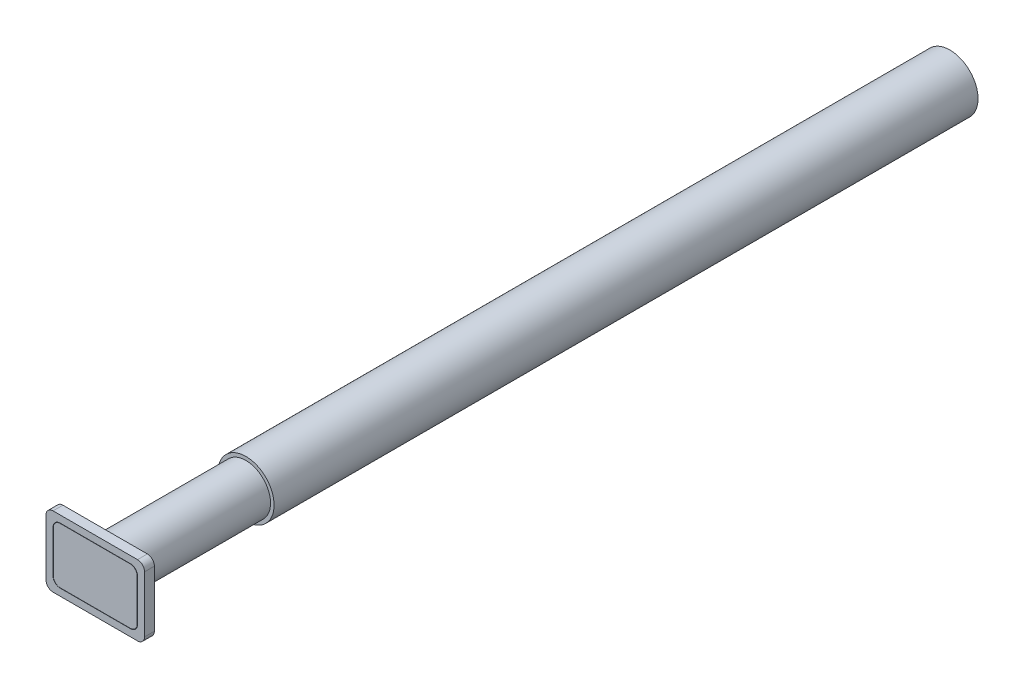
ISO-10303-21;
HEADER;
FILE_DESCRIPTION(('STEP AP214'),'2;1');
FILE_NAME('part.step','',(''),(''),'','','');
FILE_SCHEMA(('AUTOMOTIVE_DESIGN { 1 0 10303 214 1 1 1 1 }'));
ENDSEC;
DATA;
#1=APPLICATION_CONTEXT('core data for automotive mechanical design processes');
#2=APPLICATION_PROTOCOL_DEFINITION('international standard','automotive_design',2000,#1);
#3=PRODUCT_CONTEXT('',#1,'mechanical');
#4=PRODUCT('Part','Part','',(#3));
#5=PRODUCT_RELATED_PRODUCT_CATEGORY('part','',(#4));
#6=PRODUCT_DEFINITION_FORMATION('','',#4);
#7=PRODUCT_DEFINITION_CONTEXT('part definition',#1,'design');
#8=PRODUCT_DEFINITION('design','',#6,#7);
#9=PRODUCT_DEFINITION_SHAPE('','',#8);
#10=(LENGTH_UNIT() NAMED_UNIT(*) SI_UNIT(.MILLI.,.METRE.));
#11=(NAMED_UNIT(*) PLANE_ANGLE_UNIT() SI_UNIT($,.RADIAN.));
#12=(NAMED_UNIT(*) SI_UNIT($,.STERADIAN.) SOLID_ANGLE_UNIT());
#13=UNCERTAINTY_MEASURE_WITH_UNIT(LENGTH_MEASURE(1.E-05),#10,'distance_accuracy_value','');
#14=(GEOMETRIC_REPRESENTATION_CONTEXT(3) GLOBAL_UNCERTAINTY_ASSIGNED_CONTEXT((#13)) GLOBAL_UNIT_ASSIGNED_CONTEXT((#10,
#11,#12)) REPRESENTATION_CONTEXT('',''));
#15=CARTESIAN_POINT('',(0.,0.,0.));
#16=DIRECTION('',(0.,0.,1.));
#17=DIRECTION('',(1.,0.,0.));
#18=AXIS2_PLACEMENT_3D('',#15,#16,#17);
#19=CARTESIAN_POINT('',(31.496,18.796,770.89));
#20=DIRECTION('',(0.,0.,-1.));
#21=DIRECTION('',(-1.,0.,0.));
#22=AXIS2_PLACEMENT_3D('',#19,#20,#21);
#23=CYLINDRICAL_SURFACE('',#22,6.35);
#24=CARTESIAN_POINT('',(31.496,18.796,764.794));
#25=DIRECTION('',(0.,0.,1.));
#26=DIRECTION('',(-1.,0.,0.));
#27=AXIS2_PLACEMENT_3D('',#24,#25,#26);
#28=CIRCLE('',#27,6.35);
#29=CARTESIAN_POINT('',(37.846,18.796,764.794));
#30=VERTEX_POINT('',#29);
#31=CARTESIAN_POINT('',(31.496,25.146,764.794));
#32=VERTEX_POINT('',#31);
#33=EDGE_CURVE('E153',#30,#32,#28,.T.);
#34=ORIENTED_EDGE('',*,*,#33,.T.);
#35=DIRECTION('',(0.,0.,-1.));
#36=VECTOR('',#35,1.);
#37=CARTESIAN_POINT('',(31.496,25.146,770.89));
#38=LINE('',#37,#36);
#39=CARTESIAN_POINT('',(31.496,25.146,770.89));
#40=VERTEX_POINT('',#39);
#41=EDGE_CURVE('E12',#40,#32,#38,.T.);
#42=ORIENTED_EDGE('',*,*,#41,.F.);
#43=CARTESIAN_POINT('',(31.496,18.796,770.89));
#44=DIRECTION('',(0.,0.,1.));
#45=DIRECTION('',(-1.,0.,0.));
#46=AXIS2_PLACEMENT_3D('',#43,#44,#45);
#47=CIRCLE('',#46,6.35);
#48=CARTESIAN_POINT('',(37.846,18.796,770.89));
#49=VERTEX_POINT('',#48);
#50=EDGE_CURVE('E167',#49,#40,#47,.T.);
#51=ORIENTED_EDGE('',*,*,#50,.F.);
#52=DIRECTION('',(0.,0.,-1.));
#53=VECTOR('',#52,1.);
#54=CARTESIAN_POINT('',(37.846,18.796,770.89));
#55=LINE('',#54,#53);
#56=EDGE_CURVE('E149',#49,#30,#55,.T.);
#57=ORIENTED_EDGE('',*,*,#56,.T.);
#58=EDGE_LOOP('',(#34,#42,#51,#57));
#59=FACE_BOUND('',#58,.T.);
#60=ADVANCED_FACE('F57',(#59),#23,.T.);
#61=CARTESIAN_POINT('',(-31.496,25.146,770.89));
#62=DIRECTION('',(0.,-1.,0.));
#63=DIRECTION('',(1.,0.,0.));
#64=AXIS2_PLACEMENT_3D('',#61,#62,#63);
#65=PLANE('',#64);
#66=DIRECTION('',(-1.,0.,0.));
#67=VECTOR('',#66,1.);
#68=CARTESIAN_POINT('',(-31.496,25.146,764.794));
#69=LINE('',#68,#67);
#70=CARTESIAN_POINT('',(-31.496,25.146,764.794));
#71=VERTEX_POINT('',#70);
#72=EDGE_CURVE('E156',#32,#71,#69,.T.);
#73=ORIENTED_EDGE('',*,*,#72,.T.);
#74=DIRECTION('',(0.,0.,-1.));
#75=VECTOR('',#74,1.);
#76=CARTESIAN_POINT('',(-31.496,25.146,770.89));
#77=LINE('',#76,#75);
#78=CARTESIAN_POINT('',(-31.496,25.146,770.89));
#79=VERTEX_POINT('',#78);
#80=EDGE_CURVE('E65',#79,#71,#77,.T.);
#81=ORIENTED_EDGE('',*,*,#80,.F.);
#82=DIRECTION('',(-1.,0.,0.));
#83=VECTOR('',#82,1.);
#84=CARTESIAN_POINT('',(-31.496,25.146,770.89));
#85=LINE('',#84,#83);
#86=EDGE_CURVE('E116',#40,#79,#85,.T.);
#87=ORIENTED_EDGE('',*,*,#86,.F.);
#88=ORIENTED_EDGE('',*,*,#41,.T.);
#89=EDGE_LOOP('',(#73,#81,#87,#88));
#90=FACE_BOUND('',#89,.T.);
#91=ADVANCED_FACE('F202',(#90),#65,.F.);
#92=CARTESIAN_POINT('',(-31.496,18.796,770.89));
#93=DIRECTION('',(0.,0.,-1.));
#94=DIRECTION('',(-1.,0.,0.));
#95=AXIS2_PLACEMENT_3D('',#92,#93,#94);
#96=CYLINDRICAL_SURFACE('',#95,6.35);
#97=CARTESIAN_POINT('',(-31.496,18.796,764.794));
#98=DIRECTION('',(0.,0.,1.));
#99=DIRECTION('',(1.,0.,0.));
#100=AXIS2_PLACEMENT_3D('',#97,#98,#99);
#101=CIRCLE('',#100,6.35);
#102=CARTESIAN_POINT('',(-37.846,18.796,764.794));
#103=VERTEX_POINT('',#102);
#104=EDGE_CURVE('E158',#71,#103,#101,.T.);
#105=ORIENTED_EDGE('',*,*,#104,.T.);
#106=DIRECTION('',(0.,0.,-1.));
#107=VECTOR('',#106,1.);
#108=CARTESIAN_POINT('',(-37.846,18.796,770.89));
#109=LINE('',#108,#107);
#110=CARTESIAN_POINT('',(-37.846,18.796,770.89));
#111=VERTEX_POINT('',#110);
#112=EDGE_CURVE('E174',#111,#103,#109,.T.);
#113=ORIENTED_EDGE('',*,*,#112,.F.);
#114=CARTESIAN_POINT('',(-31.496,18.796,770.89));
#115=DIRECTION('',(0.,0.,1.));
#116=DIRECTION('',(1.,0.,0.));
#117=AXIS2_PLACEMENT_3D('',#114,#115,#116);
#118=CIRCLE('',#117,6.35);
#119=EDGE_CURVE('E182',#79,#111,#118,.T.);
#120=ORIENTED_EDGE('',*,*,#119,.F.);
#121=ORIENTED_EDGE('',*,*,#80,.T.);
#122=EDGE_LOOP('',(#105,#113,#120,#121));
#123=FACE_BOUND('',#122,.T.);
#124=ADVANCED_FACE('F180',(#123),#96,.T.);
#125=CARTESIAN_POINT('',(-37.846,18.796,770.89));
#126=DIRECTION('',(1.,0.,0.));
#127=DIRECTION('',(0.,0.,-1.));
#128=AXIS2_PLACEMENT_3D('',#125,#126,#127);
#129=PLANE('',#128);
#130=DIRECTION('',(0.,-1.,0.));
#131=VECTOR('',#130,1.);
#132=CARTESIAN_POINT('',(-37.846,18.796,764.794));
#133=LINE('',#132,#131);
#134=CARTESIAN_POINT('',(-37.846,-18.796,764.794));
#135=VERTEX_POINT('',#134);
#136=EDGE_CURVE('E160',#103,#135,#133,.T.);
#137=ORIENTED_EDGE('',*,*,#136,.T.);
#138=DIRECTION('',(0.,0.,-1.));
#139=VECTOR('',#138,1.);
#140=CARTESIAN_POINT('',(-37.846,-18.796,770.89));
#141=LINE('',#140,#139);
#142=CARTESIAN_POINT('',(-37.846,-18.796,770.89));
#143=VERTEX_POINT('',#142);
#144=EDGE_CURVE('E171',#143,#135,#141,.T.);
#145=ORIENTED_EDGE('',*,*,#144,.F.);
#146=DIRECTION('',(0.,-1.,0.));
#147=VECTOR('',#146,1.);
#148=CARTESIAN_POINT('',(-37.846,18.796,770.89));
#149=LINE('',#148,#147);
#150=EDGE_CURVE('E194',#111,#143,#149,.T.);
#151=ORIENTED_EDGE('',*,*,#150,.F.);
#152=ORIENTED_EDGE('',*,*,#112,.T.);
#153=EDGE_LOOP('',(#137,#145,#151,#152));
#154=FACE_BOUND('',#153,.T.);
#155=ADVANCED_FACE('F190',(#154),#129,.F.);
#156=CARTESIAN_POINT('',(-31.496,-18.796,770.89));
#157=DIRECTION('',(0.,0.,-1.));
#158=DIRECTION('',(-1.,0.,0.));
#159=AXIS2_PLACEMENT_3D('',#156,#157,#158);
#160=CYLINDRICAL_SURFACE('',#159,6.35);
#161=CARTESIAN_POINT('',(-31.496,-18.796,764.794));
#162=DIRECTION('',(0.,0.,1.));
#163=DIRECTION('',(1.,0.,0.));
#164=AXIS2_PLACEMENT_3D('',#161,#162,#163);
#165=CIRCLE('',#164,6.35);
#166=CARTESIAN_POINT('',(-31.496,-25.146,764.794));
#167=VERTEX_POINT('',#166);
#168=EDGE_CURVE('E162',#135,#167,#165,.T.);
#169=ORIENTED_EDGE('',*,*,#168,.T.);
#170=DIRECTION('',(0.,0.,-1.));
#171=VECTOR('',#170,1.);
#172=CARTESIAN_POINT('',(-31.496,-25.146,770.89));
#173=LINE('',#172,#171);
#174=CARTESIAN_POINT('',(-31.496,-25.146,770.89));
#175=VERTEX_POINT('',#174);
#176=EDGE_CURVE('E144',#175,#167,#173,.T.);
#177=ORIENTED_EDGE('',*,*,#176,.F.);
#178=CARTESIAN_POINT('',(-31.496,-18.796,770.89));
#179=DIRECTION('',(0.,0.,1.));
#180=DIRECTION('',(1.,0.,0.));
#181=AXIS2_PLACEMENT_3D('',#178,#179,#180);
#182=CIRCLE('',#181,6.35);
#183=EDGE_CURVE('E135',#143,#175,#182,.T.);
#184=ORIENTED_EDGE('',*,*,#183,.F.);
#185=ORIENTED_EDGE('',*,*,#144,.T.);
#186=EDGE_LOOP('',(#169,#177,#184,#185));
#187=FACE_BOUND('',#186,.T.);
#188=ADVANCED_FACE('F193',(#187),#160,.T.);
#189=CARTESIAN_POINT('',(-31.496,-25.146,770.89));
#190=DIRECTION('',(0.,1.,0.));
#191=DIRECTION('',(0.,0.,1.));
#192=AXIS2_PLACEMENT_3D('',#189,#190,#191);
#193=PLANE('',#192);
#194=DIRECTION('',(1.,0.,0.));
#195=VECTOR('',#194,1.);
#196=CARTESIAN_POINT('',(-31.496,-25.146,764.794));
#197=LINE('',#196,#195);
#198=CARTESIAN_POINT('',(31.496,-25.146,764.794));
#199=VERTEX_POINT('',#198);
#200=EDGE_CURVE('E143',#167,#199,#197,.T.);
#201=ORIENTED_EDGE('',*,*,#200,.T.);
#202=DIRECTION('',(0.,0.,-1.));
#203=VECTOR('',#202,1.);
#204=CARTESIAN_POINT('',(31.496,-25.146,770.89));
#205=LINE('',#204,#203);
#206=CARTESIAN_POINT('',(31.496,-25.146,770.89));
#207=VERTEX_POINT('',#206);
#208=EDGE_CURVE('E140',#207,#199,#205,.T.);
#209=ORIENTED_EDGE('',*,*,#208,.F.);
#210=DIRECTION('',(1.,0.,0.));
#211=VECTOR('',#210,1.);
#212=CARTESIAN_POINT('',(-31.496,-25.146,770.89));
#213=LINE('',#212,#211);
#214=EDGE_CURVE('E129',#175,#207,#213,.T.);
#215=ORIENTED_EDGE('',*,*,#214,.F.);
#216=ORIENTED_EDGE('',*,*,#176,.T.);
#217=EDGE_LOOP('',(#201,#209,#215,#216));
#218=FACE_BOUND('',#217,.T.);
#219=ADVANCED_FACE('F141',(#218),#193,.F.);
#220=CARTESIAN_POINT('',(31.496,-18.796,770.89));
#221=DIRECTION('',(0.,0.,-1.));
#222=DIRECTION('',(-1.,0.,0.));
#223=AXIS2_PLACEMENT_3D('',#220,#221,#222);
#224=CYLINDRICAL_SURFACE('',#223,6.35);
#225=CARTESIAN_POINT('',(31.496,-18.796,764.794));
#226=DIRECTION('',(0.,0.,1.));
#227=DIRECTION('',(1.,0.,0.));
#228=AXIS2_PLACEMENT_3D('',#225,#226,#227);
#229=CIRCLE('',#228,6.35);
#230=CARTESIAN_POINT('',(37.846,-18.796,764.794));
#231=VERTEX_POINT('',#230);
#232=EDGE_CURVE('E102',#199,#231,#229,.T.);
#233=ORIENTED_EDGE('',*,*,#232,.T.);
#234=DIRECTION('',(0.,0.,-1.));
#235=VECTOR('',#234,1.);
#236=CARTESIAN_POINT('',(37.846,-18.796,770.89));
#237=LINE('',#236,#235);
#238=CARTESIAN_POINT('',(37.846,-18.796,770.89));
#239=VERTEX_POINT('',#238);
#240=EDGE_CURVE('E145',#239,#231,#237,.T.);
#241=ORIENTED_EDGE('',*,*,#240,.F.);
#242=CARTESIAN_POINT('',(31.496,-18.796,770.89));
#243=DIRECTION('',(0.,0.,1.));
#244=DIRECTION('',(1.,0.,0.));
#245=AXIS2_PLACEMENT_3D('',#242,#243,#244);
#246=CIRCLE('',#245,6.35);
#247=EDGE_CURVE('E133',#207,#239,#246,.T.);
#248=ORIENTED_EDGE('',*,*,#247,.F.);
#249=ORIENTED_EDGE('',*,*,#208,.T.);
#250=EDGE_LOOP('',(#233,#241,#248,#249));
#251=FACE_BOUND('',#250,.T.);
#252=ADVANCED_FACE('F147',(#251),#224,.T.);
#253=CARTESIAN_POINT('',(37.846,18.796,770.89));
#254=DIRECTION('',(-1.,0.,0.));
#255=DIRECTION('',(0.,-1.,0.));
#256=AXIS2_PLACEMENT_3D('',#253,#254,#255);
#257=PLANE('',#256);
#258=DIRECTION('',(0.,1.,0.));
#259=VECTOR('',#258,1.);
#260=CARTESIAN_POINT('',(37.846,18.796,764.794));
#261=LINE('',#260,#259);
#262=EDGE_CURVE('E108',#231,#30,#261,.T.);
#263=ORIENTED_EDGE('',*,*,#262,.T.);
#264=ORIENTED_EDGE('',*,*,#56,.F.);
#265=DIRECTION('',(0.,1.,0.));
#266=VECTOR('',#265,1.);
#267=CARTESIAN_POINT('',(37.846,18.796,770.89));
#268=LINE('',#267,#266);
#269=EDGE_CURVE('E73',#239,#49,#268,.T.);
#270=ORIENTED_EDGE('',*,*,#269,.F.);
#271=ORIENTED_EDGE('',*,*,#240,.T.);
#272=EDGE_LOOP('',(#263,#264,#270,#271));
#273=FACE_BOUND('',#272,.T.);
#274=ADVANCED_FACE('F218',(#273),#257,.F.);
#275=CARTESIAN_POINT('',(31.496,18.796,770.89));
#276=DIRECTION('',(0.,0.,-1.));
#277=DIRECTION('',(-1.,0.,0.));
#278=AXIS2_PLACEMENT_3D('',#275,#276,#277);
#279=PLANE('',#278);
#280=ORIENTED_EDGE('',*,*,#50,.T.);
#281=ORIENTED_EDGE('',*,*,#86,.T.);
#282=ORIENTED_EDGE('',*,*,#119,.T.);
#283=ORIENTED_EDGE('',*,*,#150,.T.);
#284=ORIENTED_EDGE('',*,*,#183,.T.);
#285=ORIENTED_EDGE('',*,*,#214,.T.);
#286=ORIENTED_EDGE('',*,*,#247,.T.);
#287=ORIENTED_EDGE('',*,*,#269,.T.);
#288=EDGE_LOOP('',(#280,#281,#282,#283,#284,#285,#286,#287));
#289=FACE_BOUND('',#288,.T.);
#290=ADVANCED_FACE('F131',(#289),#279,.F.);
#291=CARTESIAN_POINT('',(31.496,18.796,764.794));
#292=DIRECTION('',(0.,0.,-1.));
#293=DIRECTION('',(-1.,0.,0.));
#294=AXIS2_PLACEMENT_3D('',#291,#292,#293);
#295=PLANE('',#294);
#296=ORIENTED_EDGE('',*,*,#33,.F.);
#297=ORIENTED_EDGE('',*,*,#262,.F.);
#298=ORIENTED_EDGE('',*,*,#232,.F.);
#299=ORIENTED_EDGE('',*,*,#200,.F.);
#300=ORIENTED_EDGE('',*,*,#168,.F.);
#301=ORIENTED_EDGE('',*,*,#136,.F.);
#302=ORIENTED_EDGE('',*,*,#104,.F.);
#303=ORIENTED_EDGE('',*,*,#72,.F.);
#304=EDGE_LOOP('',(#296,#297,#298,#299,#300,#301,#302,#303));
#305=FACE_BOUND('',#304,.T.);
#306=ADVANCED_FACE('F186',(#305),#295,.T.);
#307=CLOSED_SHELL('',(#60,#91,#124,#155,#188,#219,#252,#274,#290,#306));
#308=MANIFOLD_SOLID_BREP('B2',#307);
#309=CARTESIAN_POINT('',(0.,0.,635.));
#310=DIRECTION('',(0.,0.,-1.));
#311=DIRECTION('',(-1.,0.,0.));
#312=AXIS2_PLACEMENT_3D('',#309,#310,#311);
#313=CYLINDRICAL_SURFACE('',#312,25.4);
#314=CARTESIAN_POINT('',(0.,0.,635.));
#315=DIRECTION('',(0.,0.,1.));
#316=DIRECTION('',(1.,0.,0.));
#317=AXIS2_PLACEMENT_3D('',#314,#315,#316);
#318=CIRCLE('',#317,25.4);
#319=CARTESIAN_POINT('',(-25.4,0.,635.));
#320=VERTEX_POINT('',#319);
#321=EDGE_CURVE('E293',#320,#320,#318,.T.);
#322=CARTESIAN_POINT('',(0.,0.,0.));
#323=DIRECTION('',(0.,0.,1.));
#324=DIRECTION('',(1.,0.,0.));
#325=AXIS2_PLACEMENT_3D('',#322,#323,#324);
#326=CIRCLE('',#325,25.4);
#327=CARTESIAN_POINT('',(-25.4,0.,-1.11022302462516E-13));
#328=VERTEX_POINT('',#327);
#329=EDGE_CURVE('E288',#328,#328,#326,.T.);
#330=CARTESIAN_POINT('',(-25.4,0.,635.));
#331=CARTESIAN_POINT('',(-25.4,0.,628.385416666667));
#332=CARTESIAN_POINT('',(-25.4,0.,621.770833333333));
#333=CARTESIAN_POINT('',(-25.4,0.,608.541666666667));
#334=CARTESIAN_POINT('',(-25.4,0.,601.927083333333));
#335=CARTESIAN_POINT('',(-25.4,0.,588.697916666667));
#336=CARTESIAN_POINT('',(-25.4,0.,582.083333333333));
#337=CARTESIAN_POINT('',(-25.4,0.,568.854166666667));
#338=CARTESIAN_POINT('',(-25.4,0.,562.239583333333));
#339=CARTESIAN_POINT('',(-25.4,0.,549.010416666667));
#340=CARTESIAN_POINT('',(-25.4,0.,542.395833333333));
#341=CARTESIAN_POINT('',(-25.4,0.,529.166666666667));
#342=CARTESIAN_POINT('',(-25.4,0.,522.552083333333));
#343=CARTESIAN_POINT('',(-25.4,0.,509.322916666667));
#344=CARTESIAN_POINT('',(-25.4,0.,502.708333333333));
#345=CARTESIAN_POINT('',(-25.4,0.,489.479166666667));
#346=CARTESIAN_POINT('',(-25.4,0.,482.864583333333));
#347=CARTESIAN_POINT('',(-25.4,0.,469.635416666667));
#348=CARTESIAN_POINT('',(-25.4,0.,463.020833333333));
#349=CARTESIAN_POINT('',(-25.4,0.,449.791666666667));
#350=CARTESIAN_POINT('',(-25.4,0.,443.177083333333));
#351=CARTESIAN_POINT('',(-25.4,0.,429.947916666667));
#352=CARTESIAN_POINT('',(-25.4,0.,423.333333333333));
#353=CARTESIAN_POINT('',(-25.4,0.,410.104166666667));
#354=CARTESIAN_POINT('',(-25.4,0.,403.489583333333));
#355=CARTESIAN_POINT('',(-25.4,0.,390.260416666667));
#356=CARTESIAN_POINT('',(-25.4,0.,383.645833333333));
#357=CARTESIAN_POINT('',(-25.4,0.,370.416666666667));
#358=CARTESIAN_POINT('',(-25.4,0.,363.802083333333));
#359=CARTESIAN_POINT('',(-25.4,0.,350.572916666667));
#360=CARTESIAN_POINT('',(-25.4,0.,343.958333333333));
#361=CARTESIAN_POINT('',(-25.4,0.,330.729166666667));
#362=CARTESIAN_POINT('',(-25.4,0.,324.114583333333));
#363=CARTESIAN_POINT('',(-25.4,0.,310.885416666667));
#364=CARTESIAN_POINT('',(-25.4,0.,304.270833333333));
#365=CARTESIAN_POINT('',(-25.4,0.,291.041666666667));
#366=CARTESIAN_POINT('',(-25.4,0.,284.427083333333));
#367=CARTESIAN_POINT('',(-25.4,0.,271.197916666667));
#368=CARTESIAN_POINT('',(-25.4,0.,264.583333333333));
#369=CARTESIAN_POINT('',(-25.4,0.,251.354166666667));
#370=CARTESIAN_POINT('',(-25.4,0.,244.739583333333));
#371=CARTESIAN_POINT('',(-25.4,0.,231.510416666667));
#372=CARTESIAN_POINT('',(-25.4,0.,224.895833333333));
#373=CARTESIAN_POINT('',(-25.4,0.,211.666666666667));
#374=CARTESIAN_POINT('',(-25.4,0.,205.052083333333));
#375=CARTESIAN_POINT('',(-25.4,0.,191.822916666667));
#376=CARTESIAN_POINT('',(-25.4,0.,185.208333333333));
#377=CARTESIAN_POINT('',(-25.4,0.,171.979166666667));
#378=CARTESIAN_POINT('',(-25.4,0.,165.364583333333));
#379=CARTESIAN_POINT('',(-25.4,0.,152.135416666667));
#380=CARTESIAN_POINT('',(-25.4,0.,145.520833333333));
#381=CARTESIAN_POINT('',(-25.4,0.,132.291666666667));
#382=CARTESIAN_POINT('',(-25.4,0.,125.677083333333));
#383=CARTESIAN_POINT('',(-25.4,0.,112.447916666667));
#384=CARTESIAN_POINT('',(-25.4,0.,105.833333333333));
#385=CARTESIAN_POINT('',(-25.4,0.,92.6041666666666));
#386=CARTESIAN_POINT('',(-25.4,0.,85.9895833333332));
#387=CARTESIAN_POINT('',(-25.4,0.,72.7604166666665));
#388=CARTESIAN_POINT('',(-25.4,0.,66.1458333333332));
#389=CARTESIAN_POINT('',(-25.4,0.,52.9166666666666));
#390=CARTESIAN_POINT('',(-25.4,0.,46.3020833333332));
#391=CARTESIAN_POINT('',(-25.4,0.,33.0729166666666));
#392=CARTESIAN_POINT('',(-25.4,0.,26.4583333333333));
#393=CARTESIAN_POINT('',(-25.4,0.,13.2291666666666));
#394=CARTESIAN_POINT('',(-25.4,0.,6.61458333333324));
#395=CARTESIAN_POINT('',(-25.4,0.,-1.11022302462516E-13));
#396=B_SPLINE_CURVE_WITH_KNOTS('',3,(#330,#331,#332,#333,#334,#335,#336,#337,#338,#339,#340,
#341,#342,#343,#344,#345,#346,#347,#348,#349,#350,#351,#352,#353,#354,#355,#356,#357,#358,#359,
#360,#361,#362,#363,#364,#365,#366,#367,#368,#369,#370,#371,#372,#373,#374,#375,#376,#377,#378,
#379,#380,#381,#382,#383,#384,#385,#386,#387,#388,#389,#390,#391,#392,#393,#394,#395),
.UNSPECIFIED.,.F.,.F.,(4,2,2,2,2,2,2,2,2,2,2,2,2,2,2,2,2,2,2,2,2,2,2,2,2,2,2,2,2,2,2,2,4),(0.,
19.8437499999999,39.6875,59.5312499999999,79.375,99.2187499999999,119.0625,138.90625,158.75,
178.59375,198.4375,218.28125,238.125,257.96875,277.8125,297.65625,317.5,337.34375,357.1875,
377.03125,396.875,416.71875,436.5625,456.40625,476.25,496.09375,515.9375,535.78125,555.625,
575.46875,595.3125,615.15625,635.),.UNSPECIFIED.);
#397=EDGE_CURVE('BSEAM285',#320,#328,#396,.T.);
#398=ORIENTED_EDGE('',*,*,#321,.F.);
#399=ORIENTED_EDGE('',*,*,#329,.T.);
#400=ORIENTED_EDGE('',*,*,#397,.T.);
#401=ORIENTED_EDGE('',*,*,#397,.F.);
#402=EDGE_LOOP('',(#398,#400,#399,#401));
#403=FACE_BOUND('',#402,.T.);
#404=ADVANCED_FACE('F285',(#403),#313,.T.);
#405=CARTESIAN_POINT('',(0.,0.,635.));
#406=DIRECTION('',(0.,0.,1.));
#407=DIRECTION('',(1.,0.,0.));
#408=AXIS2_PLACEMENT_3D('',#405,#406,#407);
#409=PLANE('',#408);
#410=CARTESIAN_POINT('',(0.,0.,635.));
#411=DIRECTION('',(0.,0.,1.));
#412=DIRECTION('',(1.,0.,0.));
#413=AXIS2_PLACEMENT_3D('',#410,#411,#412);
#414=CIRCLE('',#413,22.225);
#415=CARTESIAN_POINT('',(22.225,0.,635.));
#416=VERTEX_POINT('',#415);
#417=EDGE_CURVE('E55',#416,#416,#414,.T.);
#418=ORIENTED_EDGE('',*,*,#417,.F.);
#419=EDGE_LOOP('',(#418));
#420=FACE_BOUND('',#419,.T.);
#421=ORIENTED_EDGE('',*,*,#321,.T.);
#422=EDGE_LOOP('',(#421));
#423=FACE_BOUND('',#422,.T.);
#424=ADVANCED_FACE('F439',(#420,#423),#409,.T.);
#425=CARTESIAN_POINT('',(0.,0.,0.));
#426=DIRECTION('',(0.,0.,1.));
#427=DIRECTION('',(1.,0.,0.));
#428=AXIS2_PLACEMENT_3D('',#425,#426,#427);
#429=PLANE('',#428);
#430=ORIENTED_EDGE('',*,*,#329,.F.);
#431=EDGE_LOOP('',(#430));
#432=FACE_BOUND('',#431,.T.);
#433=ADVANCED_FACE('F436',(#432),#429,.F.);
#434=CARTESIAN_POINT('',(0.,0.,762.));
#435=DIRECTION('',(0.,0.,-1.));
#436=DIRECTION('',(-1.,0.,0.));
#437=AXIS2_PLACEMENT_3D('',#434,#435,#436);
#438=CYLINDRICAL_SURFACE('',#437,22.225);
#439=CARTESIAN_POINT('',(0.,0.,762.));
#440=DIRECTION('',(0.,0.,1.));
#441=DIRECTION('',(1.,0.,0.));
#442=AXIS2_PLACEMENT_3D('',#439,#440,#441);
#443=CIRCLE('',#442,22.225);
#444=CARTESIAN_POINT('',(22.225,0.,762.));
#445=VERTEX_POINT('',#444);
#446=EDGE_CURVE('E427',#445,#445,#443,.T.);
#447=ORIENTED_EDGE('',*,*,#446,.F.);
#448=EDGE_LOOP('',(#447));
#449=FACE_BOUND('',#448,.T.);
#450=ORIENTED_EDGE('',*,*,#417,.T.);
#451=EDGE_LOOP('',(#450));
#452=FACE_BOUND('',#451,.T.);
#453=ADVANCED_FACE('F438',(#449,#452),#438,.T.);
#454=CARTESIAN_POINT('',(38.1,25.4,770.89));
#455=DIRECTION('',(0.,0.,-1.));
#456=DIRECTION('',(-1.,0.,0.));
#457=AXIS2_PLACEMENT_3D('',#454,#455,#456);
#458=CYLINDRICAL_SURFACE('',#457,6.35);
#459=CARTESIAN_POINT('',(38.1,25.4,762.));
#460=DIRECTION('',(0.,0.,1.));
#461=DIRECTION('',(-1.,0.,0.));
#462=AXIS2_PLACEMENT_3D('',#459,#460,#461);
#463=CIRCLE('',#462,6.35);
#464=CARTESIAN_POINT('',(44.45,25.4,762.));
#465=VERTEX_POINT('',#464);
#466=CARTESIAN_POINT('',(38.1,31.75,762.));
#467=VERTEX_POINT('',#466);
#468=EDGE_CURVE('E396',#465,#467,#463,.T.);
#469=ORIENTED_EDGE('',*,*,#468,.T.);
#470=DIRECTION('',(0.,0.,-1.));
#471=VECTOR('',#470,1.);
#472=CARTESIAN_POINT('',(38.1,31.75,770.89));
#473=LINE('',#472,#471);
#474=CARTESIAN_POINT('',(38.1,31.75,770.89));
#475=VERTEX_POINT('',#474);
#476=EDGE_CURVE('E425',#475,#467,#473,.T.);
#477=ORIENTED_EDGE('',*,*,#476,.F.);
#478=CARTESIAN_POINT('',(38.1,25.4,770.89));
#479=DIRECTION('',(0.,0.,1.));
#480=DIRECTION('',(-1.,0.,0.));
#481=AXIS2_PLACEMENT_3D('',#478,#479,#480);
#482=CIRCLE('',#481,6.35);
#483=CARTESIAN_POINT('',(44.45,25.4,770.89));
#484=VERTEX_POINT('',#483);
#485=EDGE_CURVE('E412',#484,#475,#482,.T.);
#486=ORIENTED_EDGE('',*,*,#485,.F.);
#487=DIRECTION('',(0.,0.,-1.));
#488=VECTOR('',#487,1.);
#489=CARTESIAN_POINT('',(44.45,25.4,770.89));
#490=LINE('',#489,#488);
#491=EDGE_CURVE('E392',#484,#465,#490,.T.);
#492=ORIENTED_EDGE('',*,*,#491,.T.);
#493=EDGE_LOOP('',(#469,#477,#486,#492));
#494=FACE_BOUND('',#493,.T.);
#495=ADVANCED_FACE('F444',(#494),#458,.T.);
#496=CARTESIAN_POINT('',(-38.1,31.75,770.89));
#497=DIRECTION('',(0.,-1.,0.));
#498=DIRECTION('',(0.,0.,-1.));
#499=AXIS2_PLACEMENT_3D('',#496,#497,#498);
#500=PLANE('',#499);
#501=DIRECTION('',(-1.,0.,0.));
#502=VECTOR('',#501,1.);
#503=CARTESIAN_POINT('',(-38.1,31.75,762.));
#504=LINE('',#503,#502);
#505=CARTESIAN_POINT('',(-38.1,31.75,762.));
#506=VERTEX_POINT('',#505);
#507=EDGE_CURVE('E399',#467,#506,#504,.T.);
#508=ORIENTED_EDGE('',*,*,#507,.T.);
#509=DIRECTION('',(0.,0.,-1.));
#510=VECTOR('',#509,1.);
#511=CARTESIAN_POINT('',(-38.1,31.75,770.89));
#512=LINE('',#511,#510);
#513=CARTESIAN_POINT('',(-38.1,31.75,770.89));
#514=VERTEX_POINT('',#513);
#515=EDGE_CURVE('E422',#514,#506,#512,.T.);
#516=ORIENTED_EDGE('',*,*,#515,.F.);
#517=DIRECTION('',(-1.,0.,0.));
#518=VECTOR('',#517,1.);
#519=CARTESIAN_POINT('',(-38.1,31.75,770.89));
#520=LINE('',#519,#518);
#521=EDGE_CURVE('E352',#475,#514,#520,.T.);
#522=ORIENTED_EDGE('',*,*,#521,.F.);
#523=ORIENTED_EDGE('',*,*,#476,.T.);
#524=EDGE_LOOP('',(#508,#516,#522,#523));
#525=FACE_BOUND('',#524,.T.);
#526=ADVANCED_FACE('F477',(#525),#500,.F.);
#527=CARTESIAN_POINT('',(-38.1,25.4,770.89));
#528=DIRECTION('',(0.,0.,-1.));
#529=DIRECTION('',(-1.,0.,0.));
#530=AXIS2_PLACEMENT_3D('',#527,#528,#529);
#531=CYLINDRICAL_SURFACE('',#530,6.35);
#532=CARTESIAN_POINT('',(-38.1,25.4,762.));
#533=DIRECTION('',(0.,0.,1.));
#534=DIRECTION('',(1.,0.,0.));
#535=AXIS2_PLACEMENT_3D('',#532,#533,#534);
#536=CIRCLE('',#535,6.35);
#537=CARTESIAN_POINT('',(-44.45,25.4,762.));
#538=VERTEX_POINT('',#537);
#539=EDGE_CURVE('E402',#506,#538,#536,.T.);
#540=ORIENTED_EDGE('',*,*,#539,.T.);
#541=DIRECTION('',(0.,0.,-1.));
#542=VECTOR('',#541,1.);
#543=CARTESIAN_POINT('',(-44.45,25.4,770.89));
#544=LINE('',#543,#542);
#545=CARTESIAN_POINT('',(-44.45,25.4,770.89));
#546=VERTEX_POINT('',#545);
#547=EDGE_CURVE('E419',#546,#538,#544,.T.);
#548=ORIENTED_EDGE('',*,*,#547,.F.);
#549=CARTESIAN_POINT('',(-38.1,25.4,770.89));
#550=DIRECTION('',(0.,0.,1.));
#551=DIRECTION('',(1.,0.,0.));
#552=AXIS2_PLACEMENT_3D('',#549,#550,#551);
#553=CIRCLE('',#552,6.35);
#554=EDGE_CURVE('E823',#514,#546,#553,.T.);
#555=ORIENTED_EDGE('',*,*,#554,.F.);
#556=ORIENTED_EDGE('',*,*,#515,.T.);
#557=EDGE_LOOP('',(#540,#548,#555,#556));
#558=FACE_BOUND('',#557,.T.);
#559=ADVANCED_FACE('F487',(#558),#531,.T.);
#560=CARTESIAN_POINT('',(-44.45,25.4,770.89));
#561=DIRECTION('',(1.,0.,0.));
#562=DIRECTION('',(0.,0.,-1.));
#563=AXIS2_PLACEMENT_3D('',#560,#561,#562);
#564=PLANE('',#563);
#565=DIRECTION('',(0.,-1.,0.));
#566=VECTOR('',#565,1.);
#567=CARTESIAN_POINT('',(-44.45,25.4,762.));
#568=LINE('',#567,#566);
#569=CARTESIAN_POINT('',(-44.45,-25.4,762.));
#570=VERTEX_POINT('',#569);
#571=EDGE_CURVE('E404',#538,#570,#568,.T.);
#572=ORIENTED_EDGE('',*,*,#571,.T.);
#573=DIRECTION('',(0.,0.,-1.));
#574=VECTOR('',#573,1.);
#575=CARTESIAN_POINT('',(-44.45,-25.4,770.89));
#576=LINE('',#575,#574);
#577=CARTESIAN_POINT('',(-44.45,-25.4,770.89));
#578=VERTEX_POINT('',#577);
#579=EDGE_CURVE('E416',#578,#570,#576,.T.);
#580=ORIENTED_EDGE('',*,*,#579,.F.);
#581=DIRECTION('',(0.,-1.,0.));
#582=VECTOR('',#581,1.);
#583=CARTESIAN_POINT('',(-44.45,25.4,770.89));
#584=LINE('',#583,#582);
#585=EDGE_CURVE('E825',#546,#578,#584,.T.);
#586=ORIENTED_EDGE('',*,*,#585,.F.);
#587=ORIENTED_EDGE('',*,*,#547,.T.);
#588=EDGE_LOOP('',(#572,#580,#586,#587));
#589=FACE_BOUND('',#588,.T.);
#590=ADVANCED_FACE('F496',(#589),#564,.F.);
#591=CARTESIAN_POINT('',(-38.1,-25.4,770.89));
#592=DIRECTION('',(0.,0.,-1.));
#593=DIRECTION('',(-1.,0.,0.));
#594=AXIS2_PLACEMENT_3D('',#591,#592,#593);
#595=CYLINDRICAL_SURFACE('',#594,6.35);
#596=CARTESIAN_POINT('',(-38.1,-25.4,762.));
#597=DIRECTION('',(0.,0.,1.));
#598=DIRECTION('',(1.,0.,0.));
#599=AXIS2_PLACEMENT_3D('',#596,#597,#598);
#600=CIRCLE('',#599,6.35);
#601=CARTESIAN_POINT('',(-38.1,-31.75,762.));
#602=VERTEX_POINT('',#601);
#603=EDGE_CURVE('E406',#570,#602,#600,.T.);
#604=ORIENTED_EDGE('',*,*,#603,.T.);
#605=DIRECTION('',(0.,0.,-1.));
#606=VECTOR('',#605,1.);
#607=CARTESIAN_POINT('',(-38.1,-31.75,770.89));
#608=LINE('',#607,#606);
#609=CARTESIAN_POINT('',(-38.1,-31.75,770.89));
#610=VERTEX_POINT('',#609);
#611=EDGE_CURVE('E387',#610,#602,#608,.T.);
#612=ORIENTED_EDGE('',*,*,#611,.F.);
#613=CARTESIAN_POINT('',(-38.1,-25.4,770.89));
#614=DIRECTION('',(0.,0.,1.));
#615=DIRECTION('',(1.,0.,0.));
#616=AXIS2_PLACEMENT_3D('',#613,#614,#615);
#617=CIRCLE('',#616,6.35);
#618=EDGE_CURVE('E375',#578,#610,#617,.T.);
#619=ORIENTED_EDGE('',*,*,#618,.F.);
#620=ORIENTED_EDGE('',*,*,#579,.T.);
#621=EDGE_LOOP('',(#604,#612,#619,#620));
#622=FACE_BOUND('',#621,.T.);
#623=ADVANCED_FACE('F506',(#622),#595,.T.);
#624=CARTESIAN_POINT('',(-38.1,-31.75,770.89));
#625=DIRECTION('',(0.,1.,0.));
#626=DIRECTION('',(0.,0.,1.));
#627=AXIS2_PLACEMENT_3D('',#624,#625,#626);
#628=PLANE('',#627);
#629=DIRECTION('',(1.,0.,0.));
#630=VECTOR('',#629,1.);
#631=CARTESIAN_POINT('',(-38.1,-31.75,762.));
#632=LINE('',#631,#630);
#633=CARTESIAN_POINT('',(38.1,-31.75,762.));
#634=VERTEX_POINT('',#633);
#635=EDGE_CURVE('E384',#602,#634,#632,.T.);
#636=ORIENTED_EDGE('',*,*,#635,.T.);
#637=DIRECTION('',(0.,0.,-1.));
#638=VECTOR('',#637,1.);
#639=CARTESIAN_POINT('',(38.1,-31.75,770.89));
#640=LINE('',#639,#638);
#641=CARTESIAN_POINT('',(38.1,-31.75,770.89));
#642=VERTEX_POINT('',#641);
#643=EDGE_CURVE('E381',#642,#634,#640,.T.);
#644=ORIENTED_EDGE('',*,*,#643,.F.);
#645=DIRECTION('',(1.,0.,0.));
#646=VECTOR('',#645,1.);
#647=CARTESIAN_POINT('',(-38.1,-31.75,770.89));
#648=LINE('',#647,#646);
#649=EDGE_CURVE('E368',#610,#642,#648,.T.);
#650=ORIENTED_EDGE('',*,*,#649,.F.);
#651=ORIENTED_EDGE('',*,*,#611,.T.);
#652=EDGE_LOOP('',(#636,#644,#650,#651));
#653=FACE_BOUND('',#652,.T.);
#654=ADVANCED_FACE('F382',(#653),#628,.F.);
#655=CARTESIAN_POINT('',(38.1,-25.4,770.89));
#656=DIRECTION('',(0.,0.,-1.));
#657=DIRECTION('',(-1.,0.,0.));
#658=AXIS2_PLACEMENT_3D('',#655,#656,#657);
#659=CYLINDRICAL_SURFACE('',#658,6.35);
#660=CARTESIAN_POINT('',(38.1,-25.4,762.));
#661=DIRECTION('',(0.,0.,1.));
#662=DIRECTION('',(1.,0.,0.));
#663=AXIS2_PLACEMENT_3D('',#660,#661,#662);
#664=CIRCLE('',#663,6.35);
#665=CARTESIAN_POINT('',(44.45,-25.4,762.));
#666=VERTEX_POINT('',#665);
#667=EDGE_CURVE('E409',#634,#666,#664,.T.);
#668=ORIENTED_EDGE('',*,*,#667,.T.);
#669=DIRECTION('',(0.,0.,-1.));
#670=VECTOR('',#669,1.);
#671=CARTESIAN_POINT('',(44.45,-25.4,770.89));
#672=LINE('',#671,#670);
#673=CARTESIAN_POINT('',(44.45,-25.4,770.89));
#674=VERTEX_POINT('',#673);
#675=EDGE_CURVE('E388',#674,#666,#672,.T.);
#676=ORIENTED_EDGE('',*,*,#675,.F.);
#677=CARTESIAN_POINT('',(38.1,-25.4,770.89));
#678=DIRECTION('',(0.,0.,1.));
#679=DIRECTION('',(1.,0.,0.));
#680=AXIS2_PLACEMENT_3D('',#677,#678,#679);
#681=CIRCLE('',#680,6.35);
#682=EDGE_CURVE('E372',#642,#674,#681,.T.);
#683=ORIENTED_EDGE('',*,*,#682,.F.);
#684=ORIENTED_EDGE('',*,*,#643,.T.);
#685=EDGE_LOOP('',(#668,#676,#683,#684));
#686=FACE_BOUND('',#685,.T.);
#687=ADVANCED_FACE('F390',(#686),#659,.T.);
#688=CARTESIAN_POINT('',(44.45,25.4,770.89));
#689=DIRECTION('',(-1.,0.,0.));
#690=DIRECTION('',(0.,-1.,0.));
#691=AXIS2_PLACEMENT_3D('',#688,#689,#690);
#692=PLANE('',#691);
#693=DIRECTION('',(0.,1.,0.));
#694=VECTOR('',#693,1.);
#695=CARTESIAN_POINT('',(44.45,25.4,762.));
#696=LINE('',#695,#694);
#697=EDGE_CURVE('E343',#666,#465,#696,.T.);
#698=ORIENTED_EDGE('',*,*,#697,.T.);
#699=ORIENTED_EDGE('',*,*,#491,.F.);
#700=DIRECTION('',(0.,1.,0.));
#701=VECTOR('',#700,1.);
#702=CARTESIAN_POINT('',(44.45,25.4,770.89));
#703=LINE('',#702,#701);
#704=EDGE_CURVE('E310',#674,#484,#703,.T.);
#705=ORIENTED_EDGE('',*,*,#704,.F.);
#706=ORIENTED_EDGE('',*,*,#675,.T.);
#707=EDGE_LOOP('',(#698,#699,#705,#706));
#708=FACE_BOUND('',#707,.T.);
#709=ADVANCED_FACE('F533',(#708),#692,.F.);
#710=CARTESIAN_POINT('',(38.1,25.4,770.89));
#711=DIRECTION('',(0.,0.,-1.));
#712=DIRECTION('',(-1.,0.,0.));
#713=AXIS2_PLACEMENT_3D('',#710,#711,#712);
#714=PLANE('',#713);
#715=DIRECTION('',(-1.,0.,0.));
#716=VECTOR('',#715,1.);
#717=CARTESIAN_POINT('',(-31.75,25.4,770.89));
#718=LINE('',#717,#716);
#719=CARTESIAN_POINT('',(31.75,25.4,770.89));
#720=VERTEX_POINT('',#719);
#721=CARTESIAN_POINT('',(-31.75,25.4,770.89));
#722=VERTEX_POINT('',#721);
#723=EDGE_CURVE('E784',#720,#722,#718,.T.);
#724=ORIENTED_EDGE('',*,*,#723,.F.);
#725=CARTESIAN_POINT('',(31.75,19.05,770.89));
#726=DIRECTION('',(0.,0.,1.));
#727=DIRECTION('',(-1.,0.,0.));
#728=AXIS2_PLACEMENT_3D('',#725,#726,#727);
#729=CIRCLE('',#728,6.35);
#730=CARTESIAN_POINT('',(38.1,19.05,770.89));
#731=VERTEX_POINT('',#730);
#732=EDGE_CURVE('E301',#731,#720,#729,.T.);
#733=ORIENTED_EDGE('',*,*,#732,.F.);
#734=DIRECTION('',(0.,1.,0.));
#735=VECTOR('',#734,1.);
#736=CARTESIAN_POINT('',(38.1,-19.05,770.89));
#737=LINE('',#736,#735);
#738=CARTESIAN_POINT('',(38.1,-19.05,770.89));
#739=VERTEX_POINT('',#738);
#740=EDGE_CURVE('E761',#739,#731,#737,.T.);
#741=ORIENTED_EDGE('',*,*,#740,.F.);
#742=CARTESIAN_POINT('',(31.75,-19.05,770.89));
#743=DIRECTION('',(0.,0.,1.));
#744=DIRECTION('',(1.,0.,0.));
#745=AXIS2_PLACEMENT_3D('',#742,#743,#744);
#746=CIRCLE('',#745,6.35);
#747=CARTESIAN_POINT('',(31.75,-25.4,770.89));
#748=VERTEX_POINT('',#747);
#749=EDGE_CURVE('E766',#748,#739,#746,.T.);
#750=ORIENTED_EDGE('',*,*,#749,.F.);
#751=DIRECTION('',(1.,0.,0.));
#752=VECTOR('',#751,1.);
#753=CARTESIAN_POINT('',(-31.75,-25.4,770.89));
#754=LINE('',#753,#752);
#755=CARTESIAN_POINT('',(-31.75,-25.4,770.89));
#756=VERTEX_POINT('',#755);
#757=EDGE_CURVE('E796',#756,#748,#754,.T.);
#758=ORIENTED_EDGE('',*,*,#757,.F.);
#759=CARTESIAN_POINT('',(-31.75,-19.05,770.89));
#760=DIRECTION('',(0.,0.,1.));
#761=DIRECTION('',(-1.,0.,0.));
#762=AXIS2_PLACEMENT_3D('',#759,#760,#761);
#763=CIRCLE('',#762,6.35);
#764=CARTESIAN_POINT('',(-38.1,-19.05,770.89));
#765=VERTEX_POINT('',#764);
#766=EDGE_CURVE('E793',#765,#756,#763,.T.);
#767=ORIENTED_EDGE('',*,*,#766,.F.);
#768=DIRECTION('',(0.,-1.,0.));
#769=VECTOR('',#768,1.);
#770=CARTESIAN_POINT('',(-38.1,-19.05,770.89));
#771=LINE('',#770,#769);
#772=CARTESIAN_POINT('',(-38.1,19.05,770.89));
#773=VERTEX_POINT('',#772);
#774=EDGE_CURVE('E790',#773,#765,#771,.T.);
#775=ORIENTED_EDGE('',*,*,#774,.F.);
#776=CARTESIAN_POINT('',(-31.75,19.05,770.89));
#777=DIRECTION('',(0.,0.,1.));
#778=DIRECTION('',(-1.,0.,0.));
#779=AXIS2_PLACEMENT_3D('',#776,#777,#778);
#780=CIRCLE('',#779,6.35);
#781=EDGE_CURVE('E787',#722,#773,#780,.T.);
#782=ORIENTED_EDGE('',*,*,#781,.F.);
#783=EDGE_LOOP('',(#724,#733,#741,#750,#758,#767,#775,#782));
#784=FACE_BOUND('',#783,.T.);
#785=ORIENTED_EDGE('',*,*,#485,.T.);
#786=ORIENTED_EDGE('',*,*,#521,.T.);
#787=ORIENTED_EDGE('',*,*,#554,.T.);
#788=ORIENTED_EDGE('',*,*,#585,.T.);
#789=ORIENTED_EDGE('',*,*,#618,.T.);
#790=ORIENTED_EDGE('',*,*,#649,.T.);
#791=ORIENTED_EDGE('',*,*,#682,.T.);
#792=ORIENTED_EDGE('',*,*,#704,.T.);
#793=EDGE_LOOP('',(#785,#786,#787,#788,#789,#790,#791,#792));
#794=FACE_BOUND('',#793,.T.);
#795=ADVANCED_FACE('F370',(#784,#794),#714,.F.);
#796=CARTESIAN_POINT('',(38.1,25.4,762.));
#797=DIRECTION('',(0.,0.,-1.));
#798=DIRECTION('',(-1.,0.,0.));
#799=AXIS2_PLACEMENT_3D('',#796,#797,#798);
#800=PLANE('',#799);
#801=ORIENTED_EDGE('',*,*,#446,.T.);
#802=EDGE_LOOP('',(#801));
#803=FACE_BOUND('',#802,.T.);
#804=ORIENTED_EDGE('',*,*,#468,.F.);
#805=ORIENTED_EDGE('',*,*,#697,.F.);
#806=ORIENTED_EDGE('',*,*,#667,.F.);
#807=ORIENTED_EDGE('',*,*,#635,.F.);
#808=ORIENTED_EDGE('',*,*,#603,.F.);
#809=ORIENTED_EDGE('',*,*,#571,.F.);
#810=ORIENTED_EDGE('',*,*,#539,.F.);
#811=ORIENTED_EDGE('',*,*,#507,.F.);
#812=EDGE_LOOP('',(#804,#805,#806,#807,#808,#809,#810,#811));
#813=FACE_BOUND('',#812,.T.);
#814=ADVANCED_FACE('F551',(#803,#813),#800,.T.);
#815=CARTESIAN_POINT('',(31.75,19.05,764.54));
#816=DIRECTION('',(0.,0.,1.));
#817=DIRECTION('',(1.,0.,0.));
#818=AXIS2_PLACEMENT_3D('',#815,#816,#817);
#819=CYLINDRICAL_SURFACE('',#818,6.35);
#820=ORIENTED_EDGE('',*,*,#732,.T.);
#821=DIRECTION('',(0.,0.,1.));
#822=VECTOR('',#821,1.);
#823=CARTESIAN_POINT('',(31.75,25.4,764.54));
#824=LINE('',#823,#822);
#825=CARTESIAN_POINT('',(31.75,25.4,764.54));
#826=VERTEX_POINT('',#825);
#827=EDGE_CURVE('E782',#826,#720,#824,.T.);
#828=ORIENTED_EDGE('',*,*,#827,.F.);
#829=CARTESIAN_POINT('',(31.75,19.05,764.54));
#830=DIRECTION('',(0.,0.,1.));
#831=DIRECTION('',(-1.,0.,0.));
#832=AXIS2_PLACEMENT_3D('',#829,#830,#831);
#833=CIRCLE('',#832,6.35);
#834=CARTESIAN_POINT('',(38.1,19.05,764.54));
#835=VERTEX_POINT('',#834);
#836=EDGE_CURVE('E752',#835,#826,#833,.T.);
#837=ORIENTED_EDGE('',*,*,#836,.F.);
#838=DIRECTION('',(0.,0.,1.));
#839=VECTOR('',#838,1.);
#840=CARTESIAN_POINT('',(38.1,19.05,764.54));
#841=LINE('',#840,#839);
#842=EDGE_CURVE('E400',#835,#731,#841,.T.);
#843=ORIENTED_EDGE('',*,*,#842,.T.);
#844=EDGE_LOOP('',(#820,#828,#837,#843));
#845=FACE_BOUND('',#844,.T.);
#846=ADVANCED_FACE('F561',(#845),#819,.F.);
#847=CARTESIAN_POINT('',(38.1,-19.05,764.54));
#848=DIRECTION('',(1.,0.,0.));
#849=DIRECTION('',(0.,0.,-1.));
#850=AXIS2_PLACEMENT_3D('',#847,#848,#849);
#851=PLANE('',#850);
#852=ORIENTED_EDGE('',*,*,#740,.T.);
#853=ORIENTED_EDGE('',*,*,#842,.F.);
#854=DIRECTION('',(0.,1.,0.));
#855=VECTOR('',#854,1.);
#856=CARTESIAN_POINT('',(38.1,-19.05,764.54));
#857=LINE('',#856,#855);
#858=CARTESIAN_POINT('',(38.1,-19.05,764.54));
#859=VERTEX_POINT('',#858);
#860=EDGE_CURVE('E759',#859,#835,#857,.T.);
#861=ORIENTED_EDGE('',*,*,#860,.F.);
#862=DIRECTION('',(0.,0.,1.));
#863=VECTOR('',#862,1.);
#864=CARTESIAN_POINT('',(38.1,-19.05,764.54));
#865=LINE('',#864,#863);
#866=EDGE_CURVE('E802',#859,#739,#865,.T.);
#867=ORIENTED_EDGE('',*,*,#866,.T.);
#868=EDGE_LOOP('',(#852,#853,#861,#867));
#869=FACE_BOUND('',#868,.T.);
#870=ADVANCED_FACE('F570',(#869),#851,.F.);
#871=CARTESIAN_POINT('',(31.75,-19.05,764.54));
#872=DIRECTION('',(0.,0.,1.));
#873=DIRECTION('',(1.,0.,0.));
#874=AXIS2_PLACEMENT_3D('',#871,#872,#873);
#875=CYLINDRICAL_SURFACE('',#874,6.35);
#876=ORIENTED_EDGE('',*,*,#749,.T.);
#877=ORIENTED_EDGE('',*,*,#866,.F.);
#878=CARTESIAN_POINT('',(31.75,-19.05,764.54));
#879=DIRECTION('',(0.,0.,1.));
#880=DIRECTION('',(1.,0.,0.));
#881=AXIS2_PLACEMENT_3D('',#878,#879,#880);
#882=CIRCLE('',#881,6.35);
#883=CARTESIAN_POINT('',(31.75,-25.4,764.54));
#884=VERTEX_POINT('',#883);
#885=EDGE_CURVE('E779',#884,#859,#882,.T.);
#886=ORIENTED_EDGE('',*,*,#885,.F.);
#887=DIRECTION('',(0.,0.,1.));
#888=VECTOR('',#887,1.);
#889=CARTESIAN_POINT('',(31.75,-25.4,764.54));
#890=LINE('',#889,#888);
#891=EDGE_CURVE('E805',#884,#748,#890,.T.);
#892=ORIENTED_EDGE('',*,*,#891,.T.);
#893=EDGE_LOOP('',(#876,#877,#886,#892));
#894=FACE_BOUND('',#893,.T.);
#895=ADVANCED_FACE('F579',(#894),#875,.F.);
#896=CARTESIAN_POINT('',(-31.75,-25.4,764.54));
#897=DIRECTION('',(0.,-1.,0.));
#898=DIRECTION('',(0.,0.,-1.));
#899=AXIS2_PLACEMENT_3D('',#896,#897,#898);
#900=PLANE('',#899);
#901=ORIENTED_EDGE('',*,*,#757,.T.);
#902=ORIENTED_EDGE('',*,*,#891,.F.);
#903=DIRECTION('',(1.,0.,0.));
#904=VECTOR('',#903,1.);
#905=CARTESIAN_POINT('',(-31.75,-25.4,764.54));
#906=LINE('',#905,#904);
#907=CARTESIAN_POINT('',(-31.75,-25.4,764.54));
#908=VERTEX_POINT('',#907);
#909=EDGE_CURVE('E776',#908,#884,#906,.T.);
#910=ORIENTED_EDGE('',*,*,#909,.F.);
#911=DIRECTION('',(0.,0.,1.));
#912=VECTOR('',#911,1.);
#913=CARTESIAN_POINT('',(-31.75,-25.4,764.54));
#914=LINE('',#913,#912);
#915=EDGE_CURVE('E808',#908,#756,#914,.T.);
#916=ORIENTED_EDGE('',*,*,#915,.T.);
#917=EDGE_LOOP('',(#901,#902,#910,#916));
#918=FACE_BOUND('',#917,.T.);
#919=ADVANCED_FACE('F589',(#918),#900,.F.);
#920=CARTESIAN_POINT('',(-31.75,-19.05,764.54));
#921=DIRECTION('',(0.,0.,1.));
#922=DIRECTION('',(1.,0.,0.));
#923=AXIS2_PLACEMENT_3D('',#920,#921,#922);
#924=CYLINDRICAL_SURFACE('',#923,6.35);
#925=ORIENTED_EDGE('',*,*,#766,.T.);
#926=ORIENTED_EDGE('',*,*,#915,.F.);
#927=CARTESIAN_POINT('',(-31.75,-19.05,764.54));
#928=DIRECTION('',(0.,0.,1.));
#929=DIRECTION('',(-1.,0.,0.));
#930=AXIS2_PLACEMENT_3D('',#927,#928,#929);
#931=CIRCLE('',#930,6.35);
#932=CARTESIAN_POINT('',(-38.1,-19.05,764.54));
#933=VERTEX_POINT('',#932);
#934=EDGE_CURVE('E773',#933,#908,#931,.T.);
#935=ORIENTED_EDGE('',*,*,#934,.F.);
#936=DIRECTION('',(0.,0.,1.));
#937=VECTOR('',#936,1.);
#938=CARTESIAN_POINT('',(-38.1,-19.05,764.54));
#939=LINE('',#938,#937);
#940=EDGE_CURVE('E811',#933,#765,#939,.T.);
#941=ORIENTED_EDGE('',*,*,#940,.T.);
#942=EDGE_LOOP('',(#925,#926,#935,#941));
#943=FACE_BOUND('',#942,.T.);
#944=ADVANCED_FACE('F599',(#943),#924,.F.);
#945=CARTESIAN_POINT('',(-38.1,-19.05,764.54));
#946=DIRECTION('',(-1.,0.,0.));
#947=DIRECTION('',(0.,0.,1.));
#948=AXIS2_PLACEMENT_3D('',#945,#946,#947);
#949=PLANE('',#948);
#950=ORIENTED_EDGE('',*,*,#774,.T.);
#951=ORIENTED_EDGE('',*,*,#940,.F.);
#952=DIRECTION('',(0.,-1.,0.));
#953=VECTOR('',#952,1.);
#954=CARTESIAN_POINT('',(-38.1,-19.05,764.54));
#955=LINE('',#954,#953);
#956=CARTESIAN_POINT('',(-38.1,19.05,764.54));
#957=VERTEX_POINT('',#956);
#958=EDGE_CURVE('E770',#957,#933,#955,.T.);
#959=ORIENTED_EDGE('',*,*,#958,.F.);
#960=DIRECTION('',(0.,0.,1.));
#961=VECTOR('',#960,1.);
#962=CARTESIAN_POINT('',(-38.1,19.05,764.54));
#963=LINE('',#962,#961);
#964=EDGE_CURVE('E814',#957,#773,#963,.T.);
#965=ORIENTED_EDGE('',*,*,#964,.T.);
#966=EDGE_LOOP('',(#950,#951,#959,#965));
#967=FACE_BOUND('',#966,.T.);
#968=ADVANCED_FACE('F609',(#967),#949,.F.);
#969=CARTESIAN_POINT('',(-31.75,19.05,764.54));
#970=DIRECTION('',(0.,0.,1.));
#971=DIRECTION('',(1.,0.,0.));
#972=AXIS2_PLACEMENT_3D('',#969,#970,#971);
#973=CYLINDRICAL_SURFACE('',#972,6.35);
#974=ORIENTED_EDGE('',*,*,#781,.T.);
#975=ORIENTED_EDGE('',*,*,#964,.F.);
#976=CARTESIAN_POINT('',(-31.75,19.05,764.54));
#977=DIRECTION('',(0.,0.,1.));
#978=DIRECTION('',(-1.,0.,0.));
#979=AXIS2_PLACEMENT_3D('',#976,#977,#978);
#980=CIRCLE('',#979,6.35);
#981=CARTESIAN_POINT('',(-31.75,25.4,764.54));
#982=VERTEX_POINT('',#981);
#983=EDGE_CURVE('E763',#982,#957,#980,.T.);
#984=ORIENTED_EDGE('',*,*,#983,.F.);
#985=DIRECTION('',(0.,0.,1.));
#986=VECTOR('',#985,1.);
#987=CARTESIAN_POINT('',(-31.75,25.4,764.54));
#988=LINE('',#987,#986);
#989=EDGE_CURVE('E817',#982,#722,#988,.T.);
#990=ORIENTED_EDGE('',*,*,#989,.T.);
#991=EDGE_LOOP('',(#974,#975,#984,#990));
#992=FACE_BOUND('',#991,.T.);
#993=ADVANCED_FACE('F619',(#992),#973,.F.);
#994=CARTESIAN_POINT('',(-31.75,25.4,764.54));
#995=DIRECTION('',(0.,1.,0.));
#996=DIRECTION('',(0.,0.,1.));
#997=AXIS2_PLACEMENT_3D('',#994,#995,#996);
#998=PLANE('',#997);
#999=ORIENTED_EDGE('',*,*,#723,.T.);
#1000=ORIENTED_EDGE('',*,*,#989,.F.);
#1001=DIRECTION('',(-1.,0.,0.));
#1002=VECTOR('',#1001,1.);
#1003=CARTESIAN_POINT('',(-31.75,25.4,764.54));
#1004=LINE('',#1003,#1002);
#1005=EDGE_CURVE('E756',#826,#982,#1004,.T.);
#1006=ORIENTED_EDGE('',*,*,#1005,.F.);
#1007=ORIENTED_EDGE('',*,*,#827,.T.);
#1008=EDGE_LOOP('',(#999,#1000,#1006,#1007));
#1009=FACE_BOUND('',#1008,.T.);
#1010=ADVANCED_FACE('F629',(#1009),#998,.F.);
#1011=CARTESIAN_POINT('',(31.75,19.05,764.54));
#1012=DIRECTION('',(0.,0.,-1.));
#1013=DIRECTION('',(-1.,0.,0.));
#1014=AXIS2_PLACEMENT_3D('',#1011,#1012,#1013);
#1015=PLANE('',#1014);
#1016=ORIENTED_EDGE('',*,*,#836,.T.);
#1017=ORIENTED_EDGE('',*,*,#1005,.T.);
#1018=ORIENTED_EDGE('',*,*,#983,.T.);
#1019=ORIENTED_EDGE('',*,*,#958,.T.);
#1020=ORIENTED_EDGE('',*,*,#934,.T.);
#1021=ORIENTED_EDGE('',*,*,#909,.T.);
#1022=ORIENTED_EDGE('',*,*,#885,.T.);
#1023=ORIENTED_EDGE('',*,*,#860,.T.);
#1024=EDGE_LOOP('',(#1016,#1017,#1018,#1019,#1020,#1021,#1022,#1023));
#1025=FACE_BOUND('',#1024,.T.);
#1026=ADVANCED_FACE('F639',(#1025),#1015,.F.);
#1027=CLOSED_SHELL('',(#404,#424,#433,#453,#495,#526,#559,#590,#623,#654,#687,#709,#795,#814,
#846,#870,#895,#919,#944,#968,#993,#1010,#1026));
#1028=MANIFOLD_SOLID_BREP('B6',#1027);
#1029=ADVANCED_BREP_SHAPE_REPRESENTATION('',(#18,#308,#1028),#14);
#1030=SHAPE_DEFINITION_REPRESENTATION(#9,#1029);
ENDSEC;
END-ISO-10303-21;
